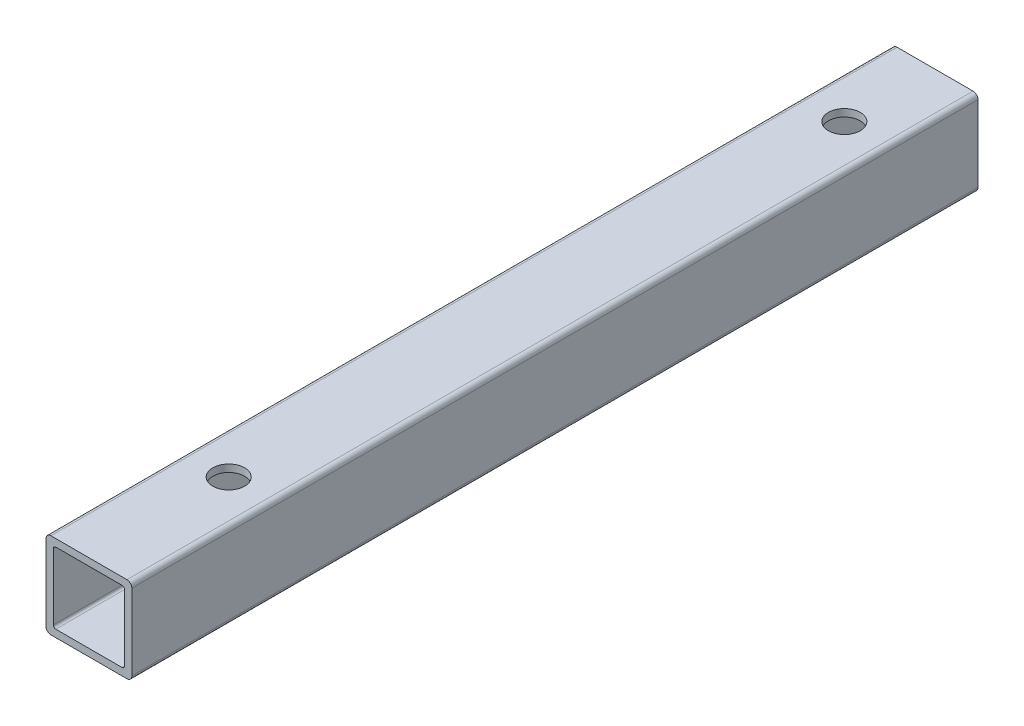
ISO-10303-21;
HEADER;
FILE_DESCRIPTION(('STEP AP214'),'2;1');
FILE_NAME('part.step','',(''),(''),'','','');
FILE_SCHEMA(('AUTOMOTIVE_DESIGN { 1 0 10303 214 1 1 1 1 }'));
ENDSEC;
DATA;
#1=APPLICATION_CONTEXT('core data for automotive mechanical design processes');
#2=APPLICATION_PROTOCOL_DEFINITION('international standard','automotive_design',2000,#1);
#3=PRODUCT_CONTEXT('',#1,'mechanical');
#4=PRODUCT('Part','Part','',(#3));
#5=PRODUCT_RELATED_PRODUCT_CATEGORY('part','',(#4));
#6=PRODUCT_DEFINITION_FORMATION('','',#4);
#7=PRODUCT_DEFINITION_CONTEXT('part definition',#1,'design');
#8=PRODUCT_DEFINITION('design','',#6,#7);
#9=PRODUCT_DEFINITION_SHAPE('','',#8);
#10=(LENGTH_UNIT() NAMED_UNIT(*) SI_UNIT(.MILLI.,.METRE.));
#11=(NAMED_UNIT(*) PLANE_ANGLE_UNIT() SI_UNIT($,.RADIAN.));
#12=(NAMED_UNIT(*) SI_UNIT($,.STERADIAN.) SOLID_ANGLE_UNIT());
#13=UNCERTAINTY_MEASURE_WITH_UNIT(LENGTH_MEASURE(1.E-05),#10,'distance_accuracy_value','');
#14=(GEOMETRIC_REPRESENTATION_CONTEXT(3) GLOBAL_UNCERTAINTY_ASSIGNED_CONTEXT((#13)) GLOBAL_UNIT_ASSIGNED_CONTEXT((#10,
#11,#12)) REPRESENTATION_CONTEXT('',''));
#15=CARTESIAN_POINT('',(0.,0.,0.));
#16=DIRECTION('',(0.,0.,1.));
#17=DIRECTION('',(1.,0.,0.));
#18=AXIS2_PLACEMENT_3D('',#15,#16,#17);
#19=CARTESIAN_POINT('',(33.,2.,345.));
#20=DIRECTION('',(0.,0.,1.));
#21=DIRECTION('',(1.,0.,0.));
#22=AXIS2_PLACEMENT_3D('',#19,#20,#21);
#23=PLANE('',#22);
#24=CARTESIAN_POINT('',(33.,2.,345.));
#25=DIRECTION('',(0.,0.,1.));
#26=DIRECTION('',(1.,0.,0.));
#27=AXIS2_PLACEMENT_3D('',#24,#25,#26);
#28=CIRCLE('',#27,2.);
#29=CARTESIAN_POINT('',(33.,0.,345.));
#30=VERTEX_POINT('',#29);
#31=CARTESIAN_POINT('',(35.,2.00000000000001,345.));
#32=VERTEX_POINT('',#31);
#33=EDGE_CURVE('E218',#30,#32,#28,.T.);
#34=ORIENTED_EDGE('',*,*,#33,.T.);
#35=DIRECTION('',(0.,1.,0.));
#36=VECTOR('',#35,1.);
#37=CARTESIAN_POINT('',(35.,2.00000000000001,345.));
#38=LINE('',#37,#36);
#39=CARTESIAN_POINT('',(35.,33.,345.));
#40=VERTEX_POINT('',#39);
#41=EDGE_CURVE('E221',#32,#40,#38,.T.);
#42=ORIENTED_EDGE('',*,*,#41,.T.);
#43=CARTESIAN_POINT('',(33.,33.,345.));
#44=DIRECTION('',(0.,0.,1.));
#45=DIRECTION('',(1.,0.,0.));
#46=AXIS2_PLACEMENT_3D('',#43,#44,#45);
#47=CIRCLE('',#46,2.);
#48=CARTESIAN_POINT('',(33.,35.,345.));
#49=VERTEX_POINT('',#48);
#50=EDGE_CURVE('E224',#40,#49,#47,.T.);
#51=ORIENTED_EDGE('',*,*,#50,.T.);
#52=DIRECTION('',(-1.,0.,0.));
#53=VECTOR('',#52,1.);
#54=CARTESIAN_POINT('',(2.00000000000001,35.,345.));
#55=LINE('',#54,#53);
#56=CARTESIAN_POINT('',(2.00000000000001,35.,345.));
#57=VERTEX_POINT('',#56);
#58=EDGE_CURVE('E226',#49,#57,#55,.T.);
#59=ORIENTED_EDGE('',*,*,#58,.T.);
#60=CARTESIAN_POINT('',(2.,33.,345.));
#61=DIRECTION('',(0.,0.,1.));
#62=DIRECTION('',(1.,0.,0.));
#63=AXIS2_PLACEMENT_3D('',#60,#61,#62);
#64=CIRCLE('',#63,2.);
#65=CARTESIAN_POINT('',(0.,33.,345.));
#66=VERTEX_POINT('',#65);
#67=EDGE_CURVE('E228',#57,#66,#64,.T.);
#68=ORIENTED_EDGE('',*,*,#67,.T.);
#69=DIRECTION('',(0.,-1.,0.));
#70=VECTOR('',#69,1.);
#71=CARTESIAN_POINT('',(0.,2.00000000000001,345.));
#72=LINE('',#71,#70);
#73=CARTESIAN_POINT('',(0.,2.00000000000001,345.));
#74=VERTEX_POINT('',#73);
#75=EDGE_CURVE('E230',#66,#74,#72,.T.);
#76=ORIENTED_EDGE('',*,*,#75,.T.);
#77=CARTESIAN_POINT('',(2.,2.,345.));
#78=DIRECTION('',(0.,0.,1.));
#79=DIRECTION('',(1.,0.,0.));
#80=AXIS2_PLACEMENT_3D('',#77,#78,#79);
#81=CIRCLE('',#80,2.);
#82=CARTESIAN_POINT('',(2.00000000000001,0.,345.));
#83=VERTEX_POINT('',#82);
#84=EDGE_CURVE('E232',#74,#83,#81,.T.);
#85=ORIENTED_EDGE('',*,*,#84,.T.);
#86=DIRECTION('',(1.,0.,0.));
#87=VECTOR('',#86,1.);
#88=CARTESIAN_POINT('',(2.00000000000001,0.,345.));
#89=LINE('',#88,#87);
#90=EDGE_CURVE('E234',#83,#30,#89,.T.);
#91=ORIENTED_EDGE('',*,*,#90,.T.);
#92=EDGE_LOOP('',(#34,#42,#51,#59,#68,#76,#85,#91));
#93=FACE_BOUND('',#92,.T.);
#94=DIRECTION('',(1.,0.,0.));
#95=VECTOR('',#94,1.);
#96=CARTESIAN_POINT('',(4.00000000000001,3.,345.));
#97=LINE('',#96,#95);
#98=CARTESIAN_POINT('',(4.00000000000001,3.,345.));
#99=VERTEX_POINT('',#98);
#100=CARTESIAN_POINT('',(31.,3.,345.));
#101=VERTEX_POINT('',#100);
#102=EDGE_CURVE('E159',#99,#101,#97,.T.);
#103=ORIENTED_EDGE('',*,*,#102,.F.);
#104=CARTESIAN_POINT('',(4.,4.,345.));
#105=DIRECTION('',(0.,0.,1.));
#106=DIRECTION('',(1.,0.,0.));
#107=AXIS2_PLACEMENT_3D('',#104,#105,#106);
#108=CIRCLE('',#107,1.);
#109=CARTESIAN_POINT('',(3.,4.00000000000001,345.));
#110=VERTEX_POINT('',#109);
#111=EDGE_CURVE('E151',#110,#99,#108,.T.);
#112=ORIENTED_EDGE('',*,*,#111,.F.);
#113=DIRECTION('',(0.,-1.,0.));
#114=VECTOR('',#113,1.);
#115=CARTESIAN_POINT('',(3.,4.00000000000001,345.));
#116=LINE('',#115,#114);
#117=CARTESIAN_POINT('',(3.,31.,345.));
#118=VERTEX_POINT('',#117);
#119=EDGE_CURVE('E185',#118,#110,#116,.T.);
#120=ORIENTED_EDGE('',*,*,#119,.F.);
#121=CARTESIAN_POINT('',(4.,31.,345.));
#122=DIRECTION('',(0.,0.,1.));
#123=DIRECTION('',(1.,0.,0.));
#124=AXIS2_PLACEMENT_3D('',#121,#122,#123);
#125=CIRCLE('',#124,1.);
#126=CARTESIAN_POINT('',(4.00000000000001,32.,345.));
#127=VERTEX_POINT('',#126);
#128=EDGE_CURVE('E183',#127,#118,#125,.T.);
#129=ORIENTED_EDGE('',*,*,#128,.F.);
#130=DIRECTION('',(-1.,0.,0.));
#131=VECTOR('',#130,1.);
#132=CARTESIAN_POINT('',(4.00000000000001,32.,345.));
#133=LINE('',#132,#131);
#134=CARTESIAN_POINT('',(31.,32.,345.));
#135=VERTEX_POINT('',#134);
#136=EDGE_CURVE('E181',#135,#127,#133,.T.);
#137=ORIENTED_EDGE('',*,*,#136,.F.);
#138=CARTESIAN_POINT('',(31.,31.,345.));
#139=DIRECTION('',(0.,0.,1.));
#140=DIRECTION('',(1.,0.,0.));
#141=AXIS2_PLACEMENT_3D('',#138,#139,#140);
#142=CIRCLE('',#141,1.);
#143=CARTESIAN_POINT('',(32.,31.,345.));
#144=VERTEX_POINT('',#143);
#145=EDGE_CURVE('E179',#144,#135,#142,.T.);
#146=ORIENTED_EDGE('',*,*,#145,.F.);
#147=DIRECTION('',(0.,1.,0.));
#148=VECTOR('',#147,1.);
#149=CARTESIAN_POINT('',(32.,4.00000000000001,345.));
#150=LINE('',#149,#148);
#151=CARTESIAN_POINT('',(32.,4.00000000000001,345.));
#152=VERTEX_POINT('',#151);
#153=EDGE_CURVE('E174',#152,#144,#150,.T.);
#154=ORIENTED_EDGE('',*,*,#153,.F.);
#155=CARTESIAN_POINT('',(31.,4.,345.));
#156=DIRECTION('',(0.,0.,1.));
#157=DIRECTION('',(1.,0.,0.));
#158=AXIS2_PLACEMENT_3D('',#155,#156,#157);
#159=CIRCLE('',#158,1.);
#160=EDGE_CURVE('E172',#101,#152,#159,.T.);
#161=ORIENTED_EDGE('',*,*,#160,.F.);
#162=EDGE_LOOP('',(#103,#112,#120,#129,#137,#146,#154,#161));
#163=FACE_BOUND('',#162,.T.);
#164=ADVANCED_FACE('F36',(#93,#163),#23,.T.);
#165=CARTESIAN_POINT('',(33.,2.,0.));
#166=DIRECTION('',(0.,0.,1.));
#167=DIRECTION('',(1.,0.,0.));
#168=AXIS2_PLACEMENT_3D('',#165,#166,#167);
#169=PLANE('',#168);
#170=CARTESIAN_POINT('',(33.,2.,0.));
#171=DIRECTION('',(0.,0.,1.));
#172=DIRECTION('',(1.,0.,0.));
#173=AXIS2_PLACEMENT_3D('',#170,#171,#172);
#174=CIRCLE('',#173,2.);
#175=CARTESIAN_POINT('',(33.,0.,0.));
#176=VERTEX_POINT('',#175);
#177=CARTESIAN_POINT('',(35.,2.00000000000001,0.));
#178=VERTEX_POINT('',#177);
#179=EDGE_CURVE('E167',#176,#178,#174,.T.);
#180=ORIENTED_EDGE('',*,*,#179,.F.);
#181=DIRECTION('',(1.,0.,0.));
#182=VECTOR('',#181,1.);
#183=CARTESIAN_POINT('',(2.00000000000001,0.,0.));
#184=LINE('',#183,#182);
#185=CARTESIAN_POINT('',(2.00000000000001,0.,0.));
#186=VERTEX_POINT('',#185);
#187=EDGE_CURVE('E222',#186,#176,#184,.T.);
#188=ORIENTED_EDGE('',*,*,#187,.F.);
#189=CARTESIAN_POINT('',(2.,2.,0.));
#190=DIRECTION('',(0.,0.,1.));
#191=DIRECTION('',(1.,0.,0.));
#192=AXIS2_PLACEMENT_3D('',#189,#190,#191);
#193=CIRCLE('',#192,2.);
#194=CARTESIAN_POINT('',(0.,2.00000000000001,0.));
#195=VERTEX_POINT('',#194);
#196=EDGE_CURVE('E249',#195,#186,#193,.T.);
#197=ORIENTED_EDGE('',*,*,#196,.F.);
#198=DIRECTION('',(0.,-1.,0.));
#199=VECTOR('',#198,1.);
#200=CARTESIAN_POINT('',(0.,2.00000000000001,0.));
#201=LINE('',#200,#199);
#202=CARTESIAN_POINT('',(0.,33.,0.));
#203=VERTEX_POINT('',#202);
#204=EDGE_CURVE('E247',#203,#195,#201,.T.);
#205=ORIENTED_EDGE('',*,*,#204,.F.);
#206=CARTESIAN_POINT('',(2.,33.,0.));
#207=DIRECTION('',(0.,0.,1.));
#208=DIRECTION('',(1.,0.,0.));
#209=AXIS2_PLACEMENT_3D('',#206,#207,#208);
#210=CIRCLE('',#209,2.);
#211=CARTESIAN_POINT('',(2.00000000000001,35.,0.));
#212=VERTEX_POINT('',#211);
#213=EDGE_CURVE('E245',#212,#203,#210,.T.);
#214=ORIENTED_EDGE('',*,*,#213,.F.);
#215=DIRECTION('',(-1.,0.,0.));
#216=VECTOR('',#215,1.);
#217=CARTESIAN_POINT('',(2.00000000000001,35.,0.));
#218=LINE('',#217,#216);
#219=CARTESIAN_POINT('',(33.,35.,0.));
#220=VERTEX_POINT('',#219);
#221=EDGE_CURVE('E243',#220,#212,#218,.T.);
#222=ORIENTED_EDGE('',*,*,#221,.F.);
#223=CARTESIAN_POINT('',(33.,33.,0.));
#224=DIRECTION('',(0.,0.,1.));
#225=DIRECTION('',(1.,0.,0.));
#226=AXIS2_PLACEMENT_3D('',#223,#224,#225);
#227=CIRCLE('',#226,2.);
#228=CARTESIAN_POINT('',(35.,33.,0.));
#229=VERTEX_POINT('',#228);
#230=EDGE_CURVE('E241',#229,#220,#227,.T.);
#231=ORIENTED_EDGE('',*,*,#230,.F.);
#232=DIRECTION('',(0.,1.,0.));
#233=VECTOR('',#232,1.);
#234=CARTESIAN_POINT('',(35.,2.00000000000001,0.));
#235=LINE('',#234,#233);
#236=EDGE_CURVE('E239',#178,#229,#235,.T.);
#237=ORIENTED_EDGE('',*,*,#236,.F.);
#238=EDGE_LOOP('',(#180,#188,#197,#205,#214,#222,#231,#237));
#239=FACE_BOUND('',#238,.T.);
#240=CARTESIAN_POINT('',(4.,4.,0.));
#241=DIRECTION('',(0.,0.,1.));
#242=DIRECTION('',(1.,0.,0.));
#243=AXIS2_PLACEMENT_3D('',#240,#241,#242);
#244=CIRCLE('',#243,1.);
#245=CARTESIAN_POINT('',(3.,4.00000000000001,0.));
#246=VERTEX_POINT('',#245);
#247=CARTESIAN_POINT('',(4.00000000000001,3.,0.));
#248=VERTEX_POINT('',#247);
#249=EDGE_CURVE('E61',#246,#248,#244,.T.);
#250=ORIENTED_EDGE('',*,*,#249,.T.);
#251=DIRECTION('',(1.,0.,0.));
#252=VECTOR('',#251,1.);
#253=CARTESIAN_POINT('',(4.00000000000001,3.,0.));
#254=LINE('',#253,#252);
#255=CARTESIAN_POINT('',(31.,3.,0.));
#256=VERTEX_POINT('',#255);
#257=EDGE_CURVE('E166',#248,#256,#254,.T.);
#258=ORIENTED_EDGE('',*,*,#257,.T.);
#259=CARTESIAN_POINT('',(31.,4.,0.));
#260=DIRECTION('',(0.,0.,1.));
#261=DIRECTION('',(1.,0.,0.));
#262=AXIS2_PLACEMENT_3D('',#259,#260,#261);
#263=CIRCLE('',#262,1.);
#264=CARTESIAN_POINT('',(32.,4.00000000000001,0.));
#265=VERTEX_POINT('',#264);
#266=EDGE_CURVE('E190',#256,#265,#263,.T.);
#267=ORIENTED_EDGE('',*,*,#266,.T.);
#268=DIRECTION('',(0.,1.,0.));
#269=VECTOR('',#268,1.);
#270=CARTESIAN_POINT('',(32.,4.00000000000001,0.));
#271=LINE('',#270,#269);
#272=CARTESIAN_POINT('',(32.,31.,0.));
#273=VERTEX_POINT('',#272);
#274=EDGE_CURVE('E193',#265,#273,#271,.T.);
#275=ORIENTED_EDGE('',*,*,#274,.T.);
#276=CARTESIAN_POINT('',(31.,31.,0.));
#277=DIRECTION('',(0.,0.,1.));
#278=DIRECTION('',(1.,0.,0.));
#279=AXIS2_PLACEMENT_3D('',#276,#277,#278);
#280=CIRCLE('',#279,1.);
#281=CARTESIAN_POINT('',(31.,32.,0.));
#282=VERTEX_POINT('',#281);
#283=EDGE_CURVE('E196',#273,#282,#280,.T.);
#284=ORIENTED_EDGE('',*,*,#283,.T.);
#285=DIRECTION('',(-1.,0.,0.));
#286=VECTOR('',#285,1.);
#287=CARTESIAN_POINT('',(4.00000000000001,32.,0.));
#288=LINE('',#287,#286);
#289=CARTESIAN_POINT('',(4.00000000000001,32.,0.));
#290=VERTEX_POINT('',#289);
#291=EDGE_CURVE('E199',#282,#290,#288,.T.);
#292=ORIENTED_EDGE('',*,*,#291,.T.);
#293=CARTESIAN_POINT('',(4.,31.,0.));
#294=DIRECTION('',(0.,0.,1.));
#295=DIRECTION('',(1.,0.,0.));
#296=AXIS2_PLACEMENT_3D('',#293,#294,#295);
#297=CIRCLE('',#296,1.);
#298=CARTESIAN_POINT('',(3.,31.,0.));
#299=VERTEX_POINT('',#298);
#300=EDGE_CURVE('E202',#290,#299,#297,.T.);
#301=ORIENTED_EDGE('',*,*,#300,.T.);
#302=DIRECTION('',(0.,-1.,0.));
#303=VECTOR('',#302,1.);
#304=CARTESIAN_POINT('',(3.,4.00000000000001,0.));
#305=LINE('',#304,#303);
#306=EDGE_CURVE('E160',#299,#246,#305,.T.);
#307=ORIENTED_EDGE('',*,*,#306,.T.);
#308=EDGE_LOOP('',(#250,#258,#267,#275,#284,#292,#301,#307));
#309=FACE_BOUND('',#308,.T.);
#310=ADVANCED_FACE('F312',(#239,#309),#169,.F.);
#311=CARTESIAN_POINT('',(33.,2.,345.));
#312=DIRECTION('',(0.,0.,-1.));
#313=DIRECTION('',(-1.,0.,0.));
#314=AXIS2_PLACEMENT_3D('',#311,#312,#313);
#315=CYLINDRICAL_SURFACE('',#314,2.);
#316=ORIENTED_EDGE('',*,*,#179,.T.);
#317=DIRECTION('',(0.,0.,-1.));
#318=VECTOR('',#317,1.);
#319=CARTESIAN_POINT('',(35.,2.00000000000001,345.));
#320=LINE('',#319,#318);
#321=EDGE_CURVE('E11',#32,#178,#320,.T.);
#322=ORIENTED_EDGE('',*,*,#321,.F.);
#323=ORIENTED_EDGE('',*,*,#33,.F.);
#324=DIRECTION('',(0.,0.,-1.));
#325=VECTOR('',#324,1.);
#326=CARTESIAN_POINT('',(33.,0.,345.));
#327=LINE('',#326,#325);
#328=EDGE_CURVE('E236',#30,#176,#327,.T.);
#329=ORIENTED_EDGE('',*,*,#328,.T.);
#330=EDGE_LOOP('',(#316,#322,#323,#329));
#331=FACE_BOUND('',#330,.T.);
#332=ADVANCED_FACE('F38',(#331),#315,.T.);
#333=CARTESIAN_POINT('',(35.,2.00000000000001,345.));
#334=DIRECTION('',(-1.,0.,0.));
#335=DIRECTION('',(0.,0.,1.));
#336=AXIS2_PLACEMENT_3D('',#333,#334,#335);
#337=PLANE('',#336);
#338=ORIENTED_EDGE('',*,*,#236,.T.);
#339=DIRECTION('',(0.,0.,-1.));
#340=VECTOR('',#339,1.);
#341=CARTESIAN_POINT('',(35.,33.,345.));
#342=LINE('',#341,#340);
#343=EDGE_CURVE('E45',#40,#229,#342,.T.);
#344=ORIENTED_EDGE('',*,*,#343,.F.);
#345=ORIENTED_EDGE('',*,*,#41,.F.);
#346=ORIENTED_EDGE('',*,*,#321,.T.);
#347=EDGE_LOOP('',(#338,#344,#345,#346));
#348=FACE_BOUND('',#347,.T.);
#349=ADVANCED_FACE('F343',(#348),#337,.F.);
#350=CARTESIAN_POINT('',(33.,33.,345.));
#351=DIRECTION('',(0.,0.,-1.));
#352=DIRECTION('',(-1.,0.,0.));
#353=AXIS2_PLACEMENT_3D('',#350,#351,#352);
#354=CYLINDRICAL_SURFACE('',#353,2.);
#355=ORIENTED_EDGE('',*,*,#230,.T.);
#356=DIRECTION('',(0.,0.,-1.));
#357=VECTOR('',#356,1.);
#358=CARTESIAN_POINT('',(33.,35.,345.));
#359=LINE('',#358,#357);
#360=EDGE_CURVE('E266',#49,#220,#359,.T.);
#361=ORIENTED_EDGE('',*,*,#360,.F.);
#362=ORIENTED_EDGE('',*,*,#50,.F.);
#363=ORIENTED_EDGE('',*,*,#343,.T.);
#364=EDGE_LOOP('',(#355,#361,#362,#363));
#365=FACE_BOUND('',#364,.T.);
#366=ADVANCED_FACE('F340',(#365),#354,.T.);
#367=CARTESIAN_POINT('',(2.00000000000001,35.,345.));
#368=DIRECTION('',(0.,-1.,0.));
#369=DIRECTION('',(0.,0.,-1.));
#370=AXIS2_PLACEMENT_3D('',#367,#368,#369);
#371=PLANE('',#370);
#372=CARTESIAN_POINT('',(17.5,35.,288.));
#373=DIRECTION('',(0.,1.,0.));
#374=DIRECTION('',(0.,0.,1.));
#375=AXIS2_PLACEMENT_3D('',#372,#373,#374);
#376=CIRCLE('',#375,6.5);
#377=CARTESIAN_POINT('',(17.5,35.,294.5));
#378=VERTEX_POINT('',#377);
#379=EDGE_CURVE('E273',#378,#378,#376,.T.);
#380=ORIENTED_EDGE('',*,*,#379,.F.);
#381=EDGE_LOOP('',(#380));
#382=FACE_BOUND('',#381,.T.);
#383=CARTESIAN_POINT('',(17.5,35.,37.));
#384=DIRECTION('',(0.,1.,0.));
#385=DIRECTION('',(0.,0.,1.));
#386=AXIS2_PLACEMENT_3D('',#383,#384,#385);
#387=CIRCLE('',#386,6.5);
#388=CARTESIAN_POINT('',(17.5,35.,43.5));
#389=VERTEX_POINT('',#388);
#390=EDGE_CURVE('E280',#389,#389,#387,.T.);
#391=ORIENTED_EDGE('',*,*,#390,.F.);
#392=EDGE_LOOP('',(#391));
#393=FACE_BOUND('',#392,.T.);
#394=ORIENTED_EDGE('',*,*,#221,.T.);
#395=DIRECTION('',(0.,0.,-1.));
#396=VECTOR('',#395,1.);
#397=CARTESIAN_POINT('',(2.00000000000001,35.,345.));
#398=LINE('',#397,#396);
#399=EDGE_CURVE('E263',#57,#212,#398,.T.);
#400=ORIENTED_EDGE('',*,*,#399,.F.);
#401=ORIENTED_EDGE('',*,*,#58,.F.);
#402=ORIENTED_EDGE('',*,*,#360,.T.);
#403=EDGE_LOOP('',(#394,#400,#401,#402));
#404=FACE_BOUND('',#403,.T.);
#405=ADVANCED_FACE('F336',(#382,#393,#404),#371,.F.);
#406=CARTESIAN_POINT('',(2.,33.,345.));
#407=DIRECTION('',(0.,0.,-1.));
#408=DIRECTION('',(-1.,0.,0.));
#409=AXIS2_PLACEMENT_3D('',#406,#407,#408);
#410=CYLINDRICAL_SURFACE('',#409,2.);
#411=ORIENTED_EDGE('',*,*,#213,.T.);
#412=DIRECTION('',(0.,0.,-1.));
#413=VECTOR('',#412,1.);
#414=CARTESIAN_POINT('',(0.,33.,345.));
#415=LINE('',#414,#413);
#416=EDGE_CURVE('E260',#66,#203,#415,.T.);
#417=ORIENTED_EDGE('',*,*,#416,.F.);
#418=ORIENTED_EDGE('',*,*,#67,.F.);
#419=ORIENTED_EDGE('',*,*,#399,.T.);
#420=EDGE_LOOP('',(#411,#417,#418,#419));
#421=FACE_BOUND('',#420,.T.);
#422=ADVANCED_FACE('F332',(#421),#410,.T.);
#423=CARTESIAN_POINT('',(0.,2.00000000000001,345.));
#424=DIRECTION('',(1.,0.,0.));
#425=DIRECTION('',(0.,0.,-1.));
#426=AXIS2_PLACEMENT_3D('',#423,#424,#425);
#427=PLANE('',#426);
#428=ORIENTED_EDGE('',*,*,#204,.T.);
#429=DIRECTION('',(0.,0.,-1.));
#430=VECTOR('',#429,1.);
#431=CARTESIAN_POINT('',(0.,2.00000000000001,345.));
#432=LINE('',#431,#430);
#433=EDGE_CURVE('E257',#74,#195,#432,.T.);
#434=ORIENTED_EDGE('',*,*,#433,.F.);
#435=ORIENTED_EDGE('',*,*,#75,.F.);
#436=ORIENTED_EDGE('',*,*,#416,.T.);
#437=EDGE_LOOP('',(#428,#434,#435,#436));
#438=FACE_BOUND('',#437,.T.);
#439=ADVANCED_FACE('F328',(#438),#427,.F.);
#440=CARTESIAN_POINT('',(2.,2.,345.));
#441=DIRECTION('',(0.,0.,-1.));
#442=DIRECTION('',(-1.,0.,0.));
#443=AXIS2_PLACEMENT_3D('',#440,#441,#442);
#444=CYLINDRICAL_SURFACE('',#443,2.);
#445=ORIENTED_EDGE('',*,*,#196,.T.);
#446=DIRECTION('',(0.,0.,-1.));
#447=VECTOR('',#446,1.);
#448=CARTESIAN_POINT('',(2.00000000000001,0.,345.));
#449=LINE('',#448,#447);
#450=EDGE_CURVE('E254',#83,#186,#449,.T.);
#451=ORIENTED_EDGE('',*,*,#450,.F.);
#452=ORIENTED_EDGE('',*,*,#84,.F.);
#453=ORIENTED_EDGE('',*,*,#433,.T.);
#454=EDGE_LOOP('',(#445,#451,#452,#453));
#455=FACE_BOUND('',#454,.T.);
#456=ADVANCED_FACE('F325',(#455),#444,.T.);
#457=CARTESIAN_POINT('',(2.00000000000001,0.,345.));
#458=DIRECTION('',(0.,1.,0.));
#459=DIRECTION('',(0.,0.,1.));
#460=AXIS2_PLACEMENT_3D('',#457,#458,#459);
#461=PLANE('',#460);
#462=CARTESIAN_POINT('',(17.5,0.,288.));
#463=DIRECTION('',(0.,1.,0.));
#464=DIRECTION('',(0.,0.,1.));
#465=AXIS2_PLACEMENT_3D('',#462,#463,#464);
#466=CIRCLE('',#465,6.5);
#467=CARTESIAN_POINT('',(17.5,0.,294.5));
#468=VERTEX_POINT('',#467);
#469=EDGE_CURVE('E188',#468,#468,#466,.T.);
#470=ORIENTED_EDGE('',*,*,#469,.T.);
#471=EDGE_LOOP('',(#470));
#472=FACE_BOUND('',#471,.T.);
#473=CARTESIAN_POINT('',(17.5,0.,37.));
#474=DIRECTION('',(0.,1.,0.));
#475=DIRECTION('',(0.,0.,1.));
#476=AXIS2_PLACEMENT_3D('',#473,#474,#475);
#477=CIRCLE('',#476,6.5);
#478=CARTESIAN_POINT('',(17.5,0.,43.5));
#479=VERTEX_POINT('',#478);
#480=EDGE_CURVE('E277',#479,#479,#477,.T.);
#481=ORIENTED_EDGE('',*,*,#480,.T.);
#482=EDGE_LOOP('',(#481));
#483=FACE_BOUND('',#482,.T.);
#484=ORIENTED_EDGE('',*,*,#187,.T.);
#485=ORIENTED_EDGE('',*,*,#328,.F.);
#486=ORIENTED_EDGE('',*,*,#90,.F.);
#487=ORIENTED_EDGE('',*,*,#450,.T.);
#488=EDGE_LOOP('',(#484,#485,#486,#487));
#489=FACE_BOUND('',#488,.T.);
#490=ADVANCED_FACE('F294',(#472,#483,#489),#461,.F.);
#491=CARTESIAN_POINT('',(4.,4.,345.));
#492=DIRECTION('',(0.,0.,-1.));
#493=DIRECTION('',(-1.,0.,0.));
#494=AXIS2_PLACEMENT_3D('',#491,#492,#493);
#495=CYLINDRICAL_SURFACE('',#494,1.);
#496=ORIENTED_EDGE('',*,*,#249,.F.);
#497=DIRECTION('',(0.,0.,-1.));
#498=VECTOR('',#497,1.);
#499=CARTESIAN_POINT('',(3.,4.00000000000001,345.));
#500=LINE('',#499,#498);
#501=EDGE_CURVE('E155',#110,#246,#500,.T.);
#502=ORIENTED_EDGE('',*,*,#501,.F.);
#503=ORIENTED_EDGE('',*,*,#111,.T.);
#504=DIRECTION('',(0.,0.,-1.));
#505=VECTOR('',#504,1.);
#506=CARTESIAN_POINT('',(4.00000000000001,3.,345.));
#507=LINE('',#506,#505);
#508=EDGE_CURVE('E154',#99,#248,#507,.T.);
#509=ORIENTED_EDGE('',*,*,#508,.T.);
#510=EDGE_LOOP('',(#496,#502,#503,#509));
#511=FACE_BOUND('',#510,.T.);
#512=ADVANCED_FACE('F153',(#511),#495,.F.);
#513=CARTESIAN_POINT('',(4.00000000000001,3.,345.));
#514=DIRECTION('',(0.,1.,0.));
#515=DIRECTION('',(0.,0.,1.));
#516=AXIS2_PLACEMENT_3D('',#513,#514,#515);
#517=PLANE('',#516);
#518=CARTESIAN_POINT('',(17.5,3.,288.));
#519=DIRECTION('',(0.,1.,0.));
#520=DIRECTION('',(0.,0.,1.));
#521=AXIS2_PLACEMENT_3D('',#518,#519,#520);
#522=CIRCLE('',#521,6.5);
#523=CARTESIAN_POINT('',(17.5,3.,294.5));
#524=VERTEX_POINT('',#523);
#525=EDGE_CURVE('E289',#524,#524,#522,.T.);
#526=ORIENTED_EDGE('',*,*,#525,.F.);
#527=EDGE_LOOP('',(#526));
#528=FACE_BOUND('',#527,.T.);
#529=CARTESIAN_POINT('',(17.5,3.,37.));
#530=DIRECTION('',(0.,1.,0.));
#531=DIRECTION('',(0.,0.,1.));
#532=AXIS2_PLACEMENT_3D('',#529,#530,#531);
#533=CIRCLE('',#532,6.5);
#534=CARTESIAN_POINT('',(17.5,3.,43.5));
#535=VERTEX_POINT('',#534);
#536=EDGE_CURVE('E272',#535,#535,#533,.T.);
#537=ORIENTED_EDGE('',*,*,#536,.F.);
#538=EDGE_LOOP('',(#537));
#539=FACE_BOUND('',#538,.T.);
#540=ORIENTED_EDGE('',*,*,#257,.F.);
#541=ORIENTED_EDGE('',*,*,#508,.F.);
#542=ORIENTED_EDGE('',*,*,#102,.T.);
#543=DIRECTION('',(0.,0.,-1.));
#544=VECTOR('',#543,1.);
#545=CARTESIAN_POINT('',(31.,3.,345.));
#546=LINE('',#545,#544);
#547=EDGE_CURVE('E168',#101,#256,#546,.T.);
#548=ORIENTED_EDGE('',*,*,#547,.T.);
#549=EDGE_LOOP('',(#540,#541,#542,#548));
#550=FACE_BOUND('',#549,.T.);
#551=ADVANCED_FACE('F163',(#528,#539,#550),#517,.T.);
#552=CARTESIAN_POINT('',(31.,4.,345.));
#553=DIRECTION('',(0.,0.,-1.));
#554=DIRECTION('',(-1.,0.,0.));
#555=AXIS2_PLACEMENT_3D('',#552,#553,#554);
#556=CYLINDRICAL_SURFACE('',#555,1.);
#557=ORIENTED_EDGE('',*,*,#266,.F.);
#558=ORIENTED_EDGE('',*,*,#547,.F.);
#559=ORIENTED_EDGE('',*,*,#160,.T.);
#560=DIRECTION('',(0.,0.,-1.));
#561=VECTOR('',#560,1.);
#562=CARTESIAN_POINT('',(32.,4.00000000000001,345.));
#563=LINE('',#562,#561);
#564=EDGE_CURVE('E215',#152,#265,#563,.T.);
#565=ORIENTED_EDGE('',*,*,#564,.T.);
#566=EDGE_LOOP('',(#557,#558,#559,#565));
#567=FACE_BOUND('',#566,.T.);
#568=ADVANCED_FACE('F398',(#567),#556,.F.);
#569=CARTESIAN_POINT('',(32.,4.00000000000001,345.));
#570=DIRECTION('',(-1.,0.,0.));
#571=DIRECTION('',(0.,0.,1.));
#572=AXIS2_PLACEMENT_3D('',#569,#570,#571);
#573=PLANE('',#572);
#574=ORIENTED_EDGE('',*,*,#274,.F.);
#575=ORIENTED_EDGE('',*,*,#564,.F.);
#576=ORIENTED_EDGE('',*,*,#153,.T.);
#577=DIRECTION('',(0.,0.,-1.));
#578=VECTOR('',#577,1.);
#579=CARTESIAN_POINT('',(32.,31.,345.));
#580=LINE('',#579,#578);
#581=EDGE_CURVE('E213',#144,#273,#580,.T.);
#582=ORIENTED_EDGE('',*,*,#581,.T.);
#583=EDGE_LOOP('',(#574,#575,#576,#582));
#584=FACE_BOUND('',#583,.T.);
#585=ADVANCED_FACE('F395',(#584),#573,.T.);
#586=CARTESIAN_POINT('',(31.,31.,345.));
#587=DIRECTION('',(0.,0.,-1.));
#588=DIRECTION('',(-1.,0.,0.));
#589=AXIS2_PLACEMENT_3D('',#586,#587,#588);
#590=CYLINDRICAL_SURFACE('',#589,1.);
#591=ORIENTED_EDGE('',*,*,#283,.F.);
#592=ORIENTED_EDGE('',*,*,#581,.F.);
#593=ORIENTED_EDGE('',*,*,#145,.T.);
#594=DIRECTION('',(0.,0.,-1.));
#595=VECTOR('',#594,1.);
#596=CARTESIAN_POINT('',(31.,32.,345.));
#597=LINE('',#596,#595);
#598=EDGE_CURVE('E211',#135,#282,#597,.T.);
#599=ORIENTED_EDGE('',*,*,#598,.T.);
#600=EDGE_LOOP('',(#591,#592,#593,#599));
#601=FACE_BOUND('',#600,.T.);
#602=ADVANCED_FACE('F390',(#601),#590,.F.);
#603=CARTESIAN_POINT('',(4.00000000000001,32.,345.));
#604=DIRECTION('',(0.,-1.,0.));
#605=DIRECTION('',(0.,0.,-1.));
#606=AXIS2_PLACEMENT_3D('',#603,#604,#605);
#607=PLANE('',#606);
#608=CARTESIAN_POINT('',(17.5,32.,288.));
#609=DIRECTION('',(0.,-1.,0.));
#610=DIRECTION('',(0.,0.,-1.));
#611=AXIS2_PLACEMENT_3D('',#608,#609,#610);
#612=CIRCLE('',#611,6.5);
#613=CARTESIAN_POINT('',(17.5,32.,281.5));
#614=VERTEX_POINT('',#613);
#615=EDGE_CURVE('E40',#614,#614,#612,.T.);
#616=ORIENTED_EDGE('',*,*,#615,.F.);
#617=EDGE_LOOP('',(#616));
#618=FACE_BOUND('',#617,.T.);
#619=CARTESIAN_POINT('',(17.5,32.,37.));
#620=DIRECTION('',(0.,-1.,0.));
#621=DIRECTION('',(0.,0.,-1.));
#622=AXIS2_PLACEMENT_3D('',#619,#620,#621);
#623=CIRCLE('',#622,6.5);
#624=CARTESIAN_POINT('',(17.5,32.,30.5));
#625=VERTEX_POINT('',#624);
#626=EDGE_CURVE('E270',#625,#625,#623,.T.);
#627=ORIENTED_EDGE('',*,*,#626,.F.);
#628=EDGE_LOOP('',(#627));
#629=FACE_BOUND('',#628,.T.);
#630=ORIENTED_EDGE('',*,*,#291,.F.);
#631=ORIENTED_EDGE('',*,*,#598,.F.);
#632=ORIENTED_EDGE('',*,*,#136,.T.);
#633=DIRECTION('',(0.,0.,-1.));
#634=VECTOR('',#633,1.);
#635=CARTESIAN_POINT('',(4.00000000000001,32.,345.));
#636=LINE('',#635,#634);
#637=EDGE_CURVE('E209',#127,#290,#636,.T.);
#638=ORIENTED_EDGE('',*,*,#637,.T.);
#639=EDGE_LOOP('',(#630,#631,#632,#638));
#640=FACE_BOUND('',#639,.T.);
#641=ADVANCED_FACE('F386',(#618,#629,#640),#607,.T.);
#642=CARTESIAN_POINT('',(4.,31.,345.));
#643=DIRECTION('',(0.,0.,-1.));
#644=DIRECTION('',(-1.,0.,0.));
#645=AXIS2_PLACEMENT_3D('',#642,#643,#644);
#646=CYLINDRICAL_SURFACE('',#645,1.);
#647=ORIENTED_EDGE('',*,*,#300,.F.);
#648=ORIENTED_EDGE('',*,*,#637,.F.);
#649=ORIENTED_EDGE('',*,*,#128,.T.);
#650=DIRECTION('',(0.,0.,-1.));
#651=VECTOR('',#650,1.);
#652=CARTESIAN_POINT('',(3.,31.,345.));
#653=LINE('',#652,#651);
#654=EDGE_CURVE('E53',#118,#299,#653,.T.);
#655=ORIENTED_EDGE('',*,*,#654,.T.);
#656=EDGE_LOOP('',(#647,#648,#649,#655));
#657=FACE_BOUND('',#656,.T.);
#658=ADVANCED_FACE('F383',(#657),#646,.F.);
#659=CARTESIAN_POINT('',(3.,4.00000000000001,345.));
#660=DIRECTION('',(1.,0.,0.));
#661=DIRECTION('',(0.,0.,-1.));
#662=AXIS2_PLACEMENT_3D('',#659,#660,#661);
#663=PLANE('',#662);
#664=ORIENTED_EDGE('',*,*,#306,.F.);
#665=ORIENTED_EDGE('',*,*,#654,.F.);
#666=ORIENTED_EDGE('',*,*,#119,.T.);
#667=ORIENTED_EDGE('',*,*,#501,.T.);
#668=EDGE_LOOP('',(#664,#665,#666,#667));
#669=FACE_BOUND('',#668,.T.);
#670=ADVANCED_FACE('F377',(#669),#663,.T.);
#671=CARTESIAN_POINT('',(17.5,-310.,37.));
#672=DIRECTION('',(0.,1.,0.));
#673=DIRECTION('',(0.,0.,1.));
#674=AXIS2_PLACEMENT_3D('',#671,#672,#673);
#675=CYLINDRICAL_SURFACE('',#674,6.5);
#676=ORIENTED_EDGE('',*,*,#626,.T.);
#677=EDGE_LOOP('',(#676));
#678=FACE_BOUND('',#677,.T.);
#679=ORIENTED_EDGE('',*,*,#390,.T.);
#680=EDGE_LOOP('',(#679));
#681=FACE_BOUND('',#680,.T.);
#682=ADVANCED_FACE('F308',(#678,#681),#675,.F.);
#683=CARTESIAN_POINT('',(17.5,-310.,288.));
#684=DIRECTION('',(0.,1.,0.));
#685=DIRECTION('',(0.,0.,1.));
#686=AXIS2_PLACEMENT_3D('',#683,#684,#685);
#687=CYLINDRICAL_SURFACE('',#686,6.5);
#688=ORIENTED_EDGE('',*,*,#615,.T.);
#689=EDGE_LOOP('',(#688));
#690=FACE_BOUND('',#689,.T.);
#691=ORIENTED_EDGE('',*,*,#379,.T.);
#692=EDGE_LOOP('',(#691));
#693=FACE_BOUND('',#692,.T.);
#694=ADVANCED_FACE('F302',(#690,#693),#687,.F.);
#695=ORIENTED_EDGE('',*,*,#536,.T.);
#696=EDGE_LOOP('',(#695));
#697=FACE_BOUND('',#696,.T.);
#698=ORIENTED_EDGE('',*,*,#480,.F.);
#699=EDGE_LOOP('',(#698));
#700=FACE_BOUND('',#699,.T.);
#701=ADVANCED_FACE('F299',(#697,#700),#675,.F.);
#702=ORIENTED_EDGE('',*,*,#525,.T.);
#703=EDGE_LOOP('',(#702));
#704=FACE_BOUND('',#703,.T.);
#705=ORIENTED_EDGE('',*,*,#469,.F.);
#706=EDGE_LOOP('',(#705));
#707=FACE_BOUND('',#706,.T.);
#708=ADVANCED_FACE('F297',(#704,#707),#687,.F.);
#709=CLOSED_SHELL('',(#164,#310,#332,#349,#366,#405,#422,#439,#456,#490,#512,#551,#568,#585,
#602,#641,#658,#670,#682,#694,#701,#708));
#710=MANIFOLD_SOLID_BREP('B2',#709);
#711=ADVANCED_BREP_SHAPE_REPRESENTATION('',(#18,#710),#14);
#712=SHAPE_DEFINITION_REPRESENTATION(#9,#711);
ENDSEC;
END-ISO-10303-21;
